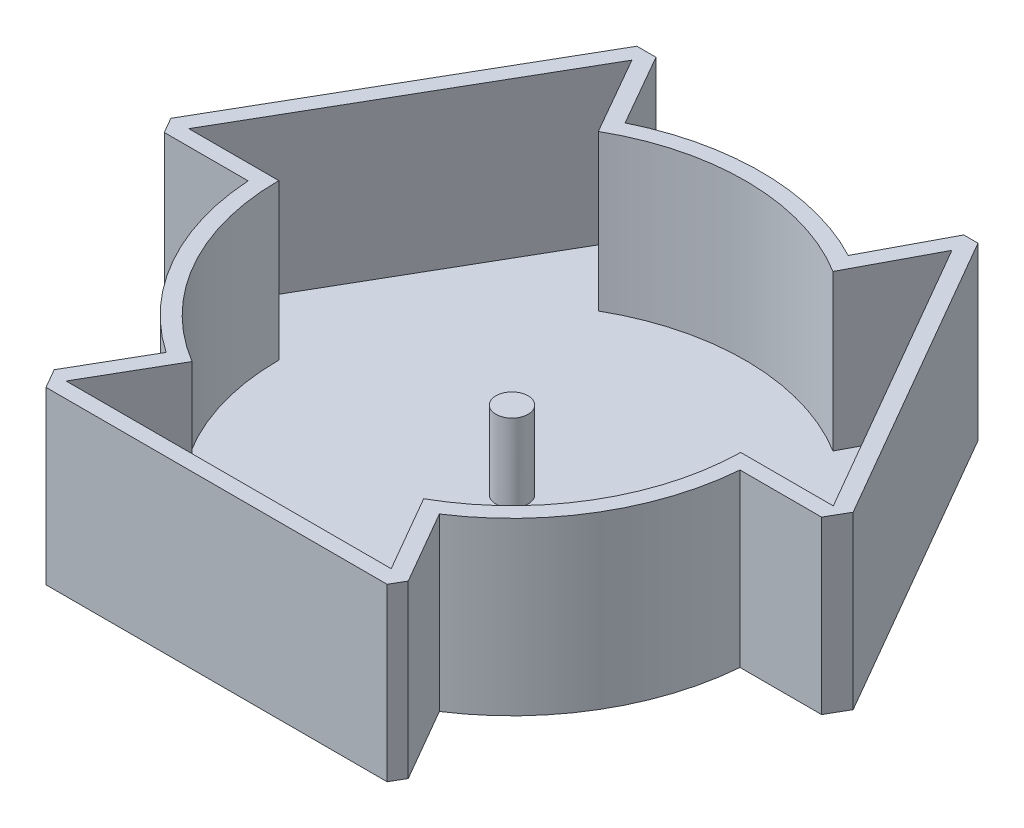
ISO-10303-21;
HEADER;
FILE_DESCRIPTION(('STEP AP214'),'2;1');
FILE_NAME('part.step','',(''),(''),'','','');
FILE_SCHEMA(('AUTOMOTIVE_DESIGN { 1 0 10303 214 1 1 1 1 }'));
ENDSEC;
DATA;
#1=APPLICATION_CONTEXT('core data for automotive mechanical design processes');
#2=APPLICATION_PROTOCOL_DEFINITION('international standard','automotive_design',2000,#1);
#3=PRODUCT_CONTEXT('',#1,'mechanical');
#4=PRODUCT('Part','Part','',(#3));
#5=PRODUCT_RELATED_PRODUCT_CATEGORY('part','',(#4));
#6=PRODUCT_DEFINITION_FORMATION('','',#4);
#7=PRODUCT_DEFINITION_CONTEXT('part definition',#1,'design');
#8=PRODUCT_DEFINITION('design','',#6,#7);
#9=PRODUCT_DEFINITION_SHAPE('','',#8);
#10=(LENGTH_UNIT() NAMED_UNIT(*) SI_UNIT(.MILLI.,.METRE.));
#11=(NAMED_UNIT(*) PLANE_ANGLE_UNIT() SI_UNIT($,.RADIAN.));
#12=(NAMED_UNIT(*) SI_UNIT($,.STERADIAN.) SOLID_ANGLE_UNIT());
#13=UNCERTAINTY_MEASURE_WITH_UNIT(LENGTH_MEASURE(1.E-05),#10,'distance_accuracy_value','');
#14=(GEOMETRIC_REPRESENTATION_CONTEXT(3) GLOBAL_UNCERTAINTY_ASSIGNED_CONTEXT((#13)) GLOBAL_UNIT_ASSIGNED_CONTEXT((#10,
#11,#12)) REPRESENTATION_CONTEXT('',''));
#15=CARTESIAN_POINT('',(0.,0.,0.));
#16=DIRECTION('',(0.,0.,1.));
#17=DIRECTION('',(1.,0.,0.));
#18=AXIS2_PLACEMENT_3D('',#15,#16,#17);
#19=CARTESIAN_POINT('',(1.89263037283323,25.4,-1.09271065523172));
#20=DIRECTION('',(0.866025403784439,0.,-0.499999999999999));
#21=DIRECTION('',(-0.499999999999999,0.,-0.866025403784439));
#22=AXIS2_PLACEMENT_3D('',#19,#20,#21);
#23=PLANE('',#22);
#24=DIRECTION('',(0.,-1.,0.));
#25=VECTOR('',#24,1.);
#26=CARTESIAN_POINT('',(29.1246775729801,25.4,46.0745786895366));
#27=LINE('',#26,#25);
#28=CARTESIAN_POINT('',(29.1246775729801,25.4,46.0745786895366));
#29=VERTEX_POINT('',#28);
#30=CARTESIAN_POINT('',(29.1246775729801,-2.54,46.0745786895366));
#31=VERTEX_POINT('',#30);
#32=EDGE_CURVE('E254',#29,#31,#27,.T.);
#33=ORIENTED_EDGE('',*,*,#32,.T.);
#34=DIRECTION('',(0.499999999999999,0.,0.866025403784439));
#35=VECTOR('',#34,1.);
#36=CARTESIAN_POINT('',(22.1832287726819,-2.54,34.051636689282));
#37=LINE('',#36,#35);
#38=CARTESIAN_POINT('',(22.1832287726819,-2.54,34.051636689282));
#39=VERTEX_POINT('',#38);
#40=EDGE_CURVE('E255',#39,#31,#37,.T.);
#41=ORIENTED_EDGE('',*,*,#40,.F.);
#42=DIRECTION('',(0.,-1.,0.));
#43=VECTOR('',#42,1.);
#44=CARTESIAN_POINT('',(22.1832287726819,25.4,34.051636689282));
#45=LINE('',#44,#43);
#46=CARTESIAN_POINT('',(22.1832287726819,25.4,34.051636689282));
#47=VERTEX_POINT('',#46);
#48=EDGE_CURVE('E60',#47,#39,#45,.T.);
#49=ORIENTED_EDGE('',*,*,#48,.F.);
#50=DIRECTION('',(0.499999999999999,0.,0.866025403784439));
#51=VECTOR('',#50,1.);
#52=CARTESIAN_POINT('',(1.89263037283323,25.4,-1.09271065523172));
#53=LINE('',#52,#51);
#54=EDGE_CURVE('E373',#47,#29,#53,.T.);
#55=ORIENTED_EDGE('',*,*,#54,.T.);
#56=EDGE_LOOP('',(#33,#41,#49,#55));
#57=FACE_BOUND('',#56,.T.);
#58=ADVANCED_FACE('F50',(#57),#23,.T.);
#59=CARTESIAN_POINT('',(0.,25.4,0.));
#60=DIRECTION('',(0.,-1.,0.));
#61=DIRECTION('',(0.,0.,-1.));
#62=AXIS2_PLACEMENT_3D('',#59,#60,#61);
#63=CYLINDRICAL_SURFACE('',#62,40.64);
#64=ORIENTED_EDGE('',*,*,#48,.T.);
#65=CARTESIAN_POINT('',(0.,-2.54,0.));
#66=DIRECTION('',(0.,-1.,0.));
#67=DIRECTION('',(0.,0.,-1.));
#68=AXIS2_PLACEMENT_3D('',#65,#66,#67);
#69=CIRCLE('',#68,40.64);
#70=CARTESIAN_POINT('',(40.5082745860141,-2.54,3.26944797543675));
#71=VERTEX_POINT('',#70);
#72=EDGE_CURVE('E244',#71,#39,#69,.T.);
#73=ORIENTED_EDGE('',*,*,#72,.F.);
#74=DIRECTION('',(0.,-1.,0.));
#75=VECTOR('',#74,1.);
#76=CARTESIAN_POINT('',(40.5082745860141,25.4,3.26944797543675));
#77=LINE('',#76,#75);
#78=CARTESIAN_POINT('',(40.5082745860141,25.4,3.26944797543675));
#79=VERTEX_POINT('',#78);
#80=EDGE_CURVE('E253',#79,#71,#77,.T.);
#81=ORIENTED_EDGE('',*,*,#80,.F.);
#82=CARTESIAN_POINT('',(0.,25.4,0.));
#83=DIRECTION('',(0.,1.,0.));
#84=DIRECTION('',(0.,0.,1.));
#85=AXIS2_PLACEMENT_3D('',#82,#83,#84);
#86=CIRCLE('',#85,40.64);
#87=EDGE_CURVE('E250',#47,#79,#86,.T.);
#88=ORIENTED_EDGE('',*,*,#87,.F.);
#89=EDGE_LOOP('',(#64,#73,#81,#88));
#90=FACE_BOUND('',#89,.T.);
#91=ADVANCED_FACE('F245',(#90),#63,.T.);
#92=CARTESIAN_POINT('',(0.,25.4,3.26944797543677));
#93=DIRECTION('',(0.,0.,-1.));
#94=DIRECTION('',(-1.,0.,0.));
#95=AXIS2_PLACEMENT_3D('',#92,#93,#94);
#96=PLANE('',#95);
#97=ORIENTED_EDGE('',*,*,#80,.T.);
#98=DIRECTION('',(-1.,0.,0.));
#99=VECTOR('',#98,1.);
#100=CARTESIAN_POINT('',(53.8382313134628,-2.54,3.26944797543675));
#101=LINE('',#100,#99);
#102=CARTESIAN_POINT('',(53.8382313134628,-2.54,3.26944797543675));
#103=VERTEX_POINT('',#102);
#104=EDGE_CURVE('E266',#103,#71,#101,.T.);
#105=ORIENTED_EDGE('',*,*,#104,.F.);
#106=DIRECTION('',(0.,-1.,0.));
#107=VECTOR('',#106,1.);
#108=CARTESIAN_POINT('',(53.8382313134628,25.4,3.26944797543675));
#109=LINE('',#108,#107);
#110=CARTESIAN_POINT('',(53.8382313134628,25.4,3.26944797543675));
#111=VERTEX_POINT('',#110);
#112=EDGE_CURVE('E517',#111,#103,#109,.T.);
#113=ORIENTED_EDGE('',*,*,#112,.F.);
#114=DIRECTION('',(1.,0.,0.));
#115=VECTOR('',#114,1.);
#116=CARTESIAN_POINT('',(0.,25.4,3.26944797543677));
#117=LINE('',#116,#115);
#118=EDGE_CURVE('E378',#79,#111,#117,.T.);
#119=ORIENTED_EDGE('',*,*,#118,.F.);
#120=EDGE_LOOP('',(#97,#105,#113,#119));
#121=FACE_BOUND('',#120,.T.);
#122=ADVANCED_FACE('F626',(#121),#96,.F.);
#123=CARTESIAN_POINT('',(41.7943859866369,25.4,24.1300000000001));
#124=DIRECTION('',(-0.866025403784438,0.,-0.500000000000002));
#125=DIRECTION('',(-0.500000000000002,0.,0.866025403784438));
#126=AXIS2_PLACEMENT_3D('',#123,#124,#125);
#127=PLANE('',#126);
#128=ORIENTED_EDGE('',*,*,#112,.T.);
#129=DIRECTION('',(-0.500000000000001,0.,0.866025403784438));
#130=VECTOR('',#129,1.);
#131=CARTESIAN_POINT('',(55.7258479821827,-2.54,0.));
#132=LINE('',#131,#130);
#133=CARTESIAN_POINT('',(55.7258479821827,-2.54,0.));
#134=VERTEX_POINT('',#133);
#135=EDGE_CURVE('E327',#134,#103,#132,.T.);
#136=ORIENTED_EDGE('',*,*,#135,.F.);
#137=DIRECTION('',(0.,-1.,0.));
#138=VECTOR('',#137,1.);
#139=CARTESIAN_POINT('',(55.7258479821827,25.4,0.));
#140=LINE('',#139,#138);
#141=CARTESIAN_POINT('',(55.7258479821827,25.4,0.));
#142=VERTEX_POINT('',#141);
#143=EDGE_CURVE('E518',#142,#134,#140,.T.);
#144=ORIENTED_EDGE('',*,*,#143,.F.);
#145=DIRECTION('',(0.500000000000002,0.,-0.866025403784438));
#146=VECTOR('',#145,1.);
#147=CARTESIAN_POINT('',(41.7943859866369,25.4,24.1300000000001));
#148=LINE('',#147,#146);
#149=EDGE_CURVE('E385',#111,#142,#148,.T.);
#150=ORIENTED_EDGE('',*,*,#149,.F.);
#151=EDGE_LOOP('',(#128,#136,#144,#150));
#152=FACE_BOUND('',#151,.T.);
#153=ADVANCED_FACE('F904',(#152),#127,.F.);
#154=CARTESIAN_POINT('',(41.794385986637,25.4,-24.13));
#155=DIRECTION('',(-0.866025403784439,0.,0.5));
#156=DIRECTION('',(0.5,0.,0.866025403784439));
#157=AXIS2_PLACEMENT_3D('',#154,#155,#156);
#158=PLANE('',#157);
#159=ORIENTED_EDGE('',*,*,#143,.T.);
#160=DIRECTION('',(0.5,0.,0.866025403784439));
#161=VECTOR('',#160,1.);
#162=CARTESIAN_POINT('',(27.8629239910913,-2.54,-48.26));
#163=LINE('',#162,#161);
#164=CARTESIAN_POINT('',(27.8629239910913,-2.54,-48.26));
#165=VERTEX_POINT('',#164);
#166=EDGE_CURVE('E322',#165,#134,#163,.T.);
#167=ORIENTED_EDGE('',*,*,#166,.F.);
#168=DIRECTION('',(0.,-1.,0.));
#169=VECTOR('',#168,1.);
#170=CARTESIAN_POINT('',(27.8629239910913,25.4,-48.26));
#171=LINE('',#170,#169);
#172=CARTESIAN_POINT('',(27.8629239910913,25.4,-48.26));
#173=VERTEX_POINT('',#172);
#174=EDGE_CURVE('E511',#173,#165,#171,.T.);
#175=ORIENTED_EDGE('',*,*,#174,.F.);
#176=DIRECTION('',(-0.5,0.,-0.866025403784439));
#177=VECTOR('',#176,1.);
#178=CARTESIAN_POINT('',(41.794385986637,25.4,-24.13));
#179=LINE('',#178,#177);
#180=EDGE_CURVE('E387',#142,#173,#179,.T.);
#181=ORIENTED_EDGE('',*,*,#180,.F.);
#182=EDGE_LOOP('',(#159,#167,#175,#181));
#183=FACE_BOUND('',#182,.T.);
#184=ADVANCED_FACE('F894',(#183),#158,.F.);
#185=CARTESIAN_POINT('',(0.,25.4,-48.26));
#186=DIRECTION('',(0.,0.,1.));
#187=DIRECTION('',(1.,0.,0.));
#188=AXIS2_PLACEMENT_3D('',#185,#186,#187);
#189=PLANE('',#188);
#190=ORIENTED_EDGE('',*,*,#174,.T.);
#191=DIRECTION('',(1.,0.,0.));
#192=VECTOR('',#191,1.);
#193=CARTESIAN_POINT('',(25.5330111041425,-2.54,-48.26));
#194=LINE('',#193,#192);
#195=CARTESIAN_POINT('',(25.5330111041425,-2.54,-48.26));
#196=VERTEX_POINT('',#195);
#197=EDGE_CURVE('E319',#196,#165,#194,.T.);
#198=ORIENTED_EDGE('',*,*,#197,.F.);
#199=DIRECTION('',(0.,-1.,0.));
#200=VECTOR('',#199,1.);
#201=CARTESIAN_POINT('',(25.5330111041425,25.4,-48.26));
#202=LINE('',#201,#200);
#203=CARTESIAN_POINT('',(25.5330111041425,25.4,-48.26));
#204=VERTEX_POINT('',#203);
#205=EDGE_CURVE('E509',#204,#196,#202,.T.);
#206=ORIENTED_EDGE('',*,*,#205,.F.);
#207=DIRECTION('',(-1.,0.,0.));
#208=VECTOR('',#207,1.);
#209=CARTESIAN_POINT('',(0.,25.4,-48.26));
#210=LINE('',#209,#208);
#211=EDGE_CURVE('E388',#173,#204,#210,.T.);
#212=ORIENTED_EDGE('',*,*,#211,.F.);
#213=EDGE_LOOP('',(#190,#198,#206,#212));
#214=FACE_BOUND('',#213,.T.);
#215=ADVANCED_FACE('F883',(#214),#189,.F.);
#216=CARTESIAN_POINT('',(0.,25.4,0.));
#217=DIRECTION('',(0.883912099849341,0.,0.467653076264798));
#218=DIRECTION('',(0.467653076264798,0.,-0.883912099849341));
#219=AXIS2_PLACEMENT_3D('',#216,#217,#218);
#220=PLANE('',#219);
#221=ORIENTED_EDGE('',*,*,#205,.T.);
#222=DIRECTION('',(0.467653076264798,0.,-0.883912099849341));
#223=VECTOR('',#222,1.);
#224=CARTESIAN_POINT('',(19.0054210194014,-2.54,-35.9221877378772));
#225=LINE('',#224,#223);
#226=CARTESIAN_POINT('',(19.0054210194014,-2.54,-35.9221877378772));
#227=VERTEX_POINT('',#226);
#228=EDGE_CURVE('E316',#227,#196,#225,.T.);
#229=ORIENTED_EDGE('',*,*,#228,.F.);
#230=DIRECTION('',(0.,-1.,0.));
#231=VECTOR('',#230,1.);
#232=CARTESIAN_POINT('',(19.0054210194014,25.4,-35.9221877378772));
#233=LINE('',#232,#231);
#234=CARTESIAN_POINT('',(19.0054210194014,25.4,-35.9221877378772));
#235=VERTEX_POINT('',#234);
#236=EDGE_CURVE('E510',#235,#227,#233,.T.);
#237=ORIENTED_EDGE('',*,*,#236,.F.);
#238=DIRECTION('',(-0.467653076264798,0.,0.883912099849341));
#239=VECTOR('',#238,1.);
#240=CARTESIAN_POINT('',(0.,25.4,0.));
#241=LINE('',#240,#239);
#242=EDGE_CURVE('E392',#204,#235,#241,.T.);
#243=ORIENTED_EDGE('',*,*,#242,.F.);
#244=EDGE_LOOP('',(#221,#229,#237,#243));
#245=FACE_BOUND('',#244,.T.);
#246=ADVANCED_FACE('F874',(#245),#220,.F.);
#247=CARTESIAN_POINT('',(0.,25.4,0.));
#248=DIRECTION('',(0.,-1.,0.));
#249=DIRECTION('',(0.,0.,-1.));
#250=AXIS2_PLACEMENT_3D('',#247,#248,#249);
#251=CYLINDRICAL_SURFACE('',#250,40.64);
#252=ORIENTED_EDGE('',*,*,#236,.T.);
#253=CARTESIAN_POINT('',(0.,-2.54,0.));
#254=DIRECTION('',(0.,-1.,0.));
#255=DIRECTION('',(0.,0.,-1.));
#256=AXIS2_PLACEMENT_3D('',#253,#254,#255);
#257=CIRCLE('',#256,40.64);
#258=CARTESIAN_POINT('',(-17.9750099502659,-2.54,-36.4487121485498));
#259=VERTEX_POINT('',#258);
#260=EDGE_CURVE('E315',#259,#227,#257,.T.);
#261=ORIENTED_EDGE('',*,*,#260,.F.);
#262=DIRECTION('',(0.,-1.,0.));
#263=VECTOR('',#262,1.);
#264=CARTESIAN_POINT('',(-17.9750099502659,25.4,-36.4487121485498));
#265=LINE('',#264,#263);
#266=CARTESIAN_POINT('',(-17.9750099502659,25.4,-36.4487121485498));
#267=VERTEX_POINT('',#266);
#268=EDGE_CURVE('E502',#267,#259,#265,.T.);
#269=ORIENTED_EDGE('',*,*,#268,.F.);
#270=CARTESIAN_POINT('',(0.,25.4,0.));
#271=DIRECTION('',(0.,1.,0.));
#272=DIRECTION('',(0.,0.,1.));
#273=AXIS2_PLACEMENT_3D('',#270,#271,#272);
#274=CIRCLE('',#273,40.64);
#275=EDGE_CURVE('E398',#235,#267,#274,.T.);
#276=ORIENTED_EDGE('',*,*,#275,.F.);
#277=EDGE_LOOP('',(#252,#261,#269,#276));
#278=FACE_BOUND('',#277,.T.);
#279=ADVANCED_FACE('F862',(#278),#251,.T.);
#280=CARTESIAN_POINT('',(2.17388127227108,25.4,-1.24419538492157));
#281=DIRECTION('',(0.867902843515905,0.,-0.496733987378564));
#282=DIRECTION('',(-0.496733987378564,0.,-0.867902843515905));
#283=AXIS2_PLACEMENT_3D('',#280,#281,#282);
#284=PLANE('',#283);
#285=ORIENTED_EDGE('',*,*,#268,.T.);
#286=DIRECTION('',(0.496733987378564,0.,0.867902843515905));
#287=VECTOR('',#286,1.);
#288=CARTESIAN_POINT('',(-24.7350616707548,-2.54,-48.26));
#289=LINE('',#288,#287);
#290=CARTESIAN_POINT('',(-24.7350616707548,-2.54,-48.26));
#291=VERTEX_POINT('',#290);
#292=EDGE_CURVE('E306',#291,#259,#289,.T.);
#293=ORIENTED_EDGE('',*,*,#292,.F.);
#294=DIRECTION('',(0.,-1.,0.));
#295=VECTOR('',#294,1.);
#296=CARTESIAN_POINT('',(-24.7350616707548,25.4,-48.26));
#297=LINE('',#296,#295);
#298=CARTESIAN_POINT('',(-24.7350616707548,25.4,-48.26));
#299=VERTEX_POINT('',#298);
#300=EDGE_CURVE('E503',#299,#291,#297,.T.);
#301=ORIENTED_EDGE('',*,*,#300,.F.);
#302=DIRECTION('',(0.496733987378564,0.,0.867902843515905));
#303=VECTOR('',#302,1.);
#304=CARTESIAN_POINT('',(2.17388127227108,25.4,-1.24419538492157));
#305=LINE('',#304,#303);
#306=EDGE_CURVE('E402',#299,#267,#305,.T.);
#307=ORIENTED_EDGE('',*,*,#306,.T.);
#308=EDGE_LOOP('',(#285,#293,#301,#307));
#309=FACE_BOUND('',#308,.T.);
#310=ADVANCED_FACE('F854',(#309),#284,.T.);
#311=CARTESIAN_POINT('',(0.,25.4,-48.26));
#312=DIRECTION('',(0.,0.,1.));
#313=DIRECTION('',(1.,0.,0.));
#314=AXIS2_PLACEMENT_3D('',#311,#312,#313);
#315=PLANE('',#314);
#316=ORIENTED_EDGE('',*,*,#300,.T.);
#317=DIRECTION('',(1.,0.,0.));
#318=VECTOR('',#317,1.);
#319=CARTESIAN_POINT('',(-27.8629239910913,-2.54,-48.26));
#320=LINE('',#319,#318);
#321=CARTESIAN_POINT('',(-27.8629239910913,-2.54,-48.26));
#322=VERTEX_POINT('',#321);
#323=EDGE_CURVE('E302',#322,#291,#320,.T.);
#324=ORIENTED_EDGE('',*,*,#323,.F.);
#325=DIRECTION('',(0.,-1.,0.));
#326=VECTOR('',#325,1.);
#327=CARTESIAN_POINT('',(-27.8629239910913,25.4,-48.26));
#328=LINE('',#327,#326);
#329=CARTESIAN_POINT('',(-27.8629239910913,25.4,-48.26));
#330=VERTEX_POINT('',#329);
#331=EDGE_CURVE('E499',#330,#322,#328,.T.);
#332=ORIENTED_EDGE('',*,*,#331,.F.);
#333=DIRECTION('',(-1.,0.,0.));
#334=VECTOR('',#333,1.);
#335=CARTESIAN_POINT('',(0.,25.4,-48.26));
#336=LINE('',#335,#334);
#337=EDGE_CURVE('E403',#299,#330,#336,.T.);
#338=ORIENTED_EDGE('',*,*,#337,.F.);
#339=EDGE_LOOP('',(#316,#324,#332,#338));
#340=FACE_BOUND('',#339,.T.);
#341=ADVANCED_FACE('F843',(#340),#315,.F.);
#342=CARTESIAN_POINT('',(-41.794385986637,25.4,-24.13));
#343=DIRECTION('',(0.866025403784439,0.,0.5));
#344=DIRECTION('',(0.5,0.,-0.866025403784439));
#345=AXIS2_PLACEMENT_3D('',#342,#343,#344);
#346=PLANE('',#345);
#347=ORIENTED_EDGE('',*,*,#331,.T.);
#348=DIRECTION('',(0.5,0.,-0.866025403784438));
#349=VECTOR('',#348,1.);
#350=CARTESIAN_POINT('',(-55.7258479821827,-2.54,0.));
#351=LINE('',#350,#349);
#352=CARTESIAN_POINT('',(-55.7258479821827,-2.54,0.));
#353=VERTEX_POINT('',#352);
#354=EDGE_CURVE('E299',#353,#322,#351,.T.);
#355=ORIENTED_EDGE('',*,*,#354,.F.);
#356=DIRECTION('',(0.,-1.,0.));
#357=VECTOR('',#356,1.);
#358=CARTESIAN_POINT('',(-55.7258479821827,25.4,0.));
#359=LINE('',#358,#357);
#360=CARTESIAN_POINT('',(-55.7258479821827,25.4,0.));
#361=VERTEX_POINT('',#360);
#362=EDGE_CURVE('E494',#361,#353,#359,.T.);
#363=ORIENTED_EDGE('',*,*,#362,.F.);
#364=DIRECTION('',(-0.5,0.,0.866025403784439));
#365=VECTOR('',#364,1.);
#366=CARTESIAN_POINT('',(-41.794385986637,25.4,-24.13));
#367=LINE('',#366,#365);
#368=EDGE_CURVE('E407',#330,#361,#367,.T.);
#369=ORIENTED_EDGE('',*,*,#368,.F.);
#370=EDGE_LOOP('',(#347,#355,#363,#369));
#371=FACE_BOUND('',#370,.T.);
#372=ADVANCED_FACE('F834',(#371),#346,.F.);
#373=CARTESIAN_POINT('',(-41.7943859866369,25.4,24.13));
#374=DIRECTION('',(0.866025403784438,0.,-0.500000000000001));
#375=DIRECTION('',(-0.500000000000001,0.,-0.866025403784438));
#376=AXIS2_PLACEMENT_3D('',#373,#374,#375);
#377=PLANE('',#376);
#378=ORIENTED_EDGE('',*,*,#362,.T.);
#379=DIRECTION('',(-0.500000000000002,0.,-0.866025403784438));
#380=VECTOR('',#379,1.);
#381=CARTESIAN_POINT('',(-54.259378298441,-2.54,2.54000000000001));
#382=LINE('',#381,#380);
#383=CARTESIAN_POINT('',(-54.259378298441,-2.54,2.54000000000001));
#384=VERTEX_POINT('',#383);
#385=EDGE_CURVE('E298',#384,#353,#382,.T.);
#386=ORIENTED_EDGE('',*,*,#385,.F.);
#387=DIRECTION('',(0.,-1.,0.));
#388=VECTOR('',#387,1.);
#389=CARTESIAN_POINT('',(-54.259378298441,25.4,2.54000000000001));
#390=LINE('',#389,#388);
#391=CARTESIAN_POINT('',(-54.259378298441,25.4,2.54000000000001));
#392=VERTEX_POINT('',#391);
#393=EDGE_CURVE('E495',#392,#384,#390,.T.);
#394=ORIENTED_EDGE('',*,*,#393,.F.);
#395=DIRECTION('',(0.500000000000001,0.,0.866025403784438));
#396=VECTOR('',#395,1.);
#397=CARTESIAN_POINT('',(-41.7943859866369,25.4,24.13));
#398=LINE('',#397,#396);
#399=EDGE_CURVE('E413',#361,#392,#398,.T.);
#400=ORIENTED_EDGE('',*,*,#399,.F.);
#401=EDGE_LOOP('',(#378,#386,#394,#400));
#402=FACE_BOUND('',#401,.T.);
#403=ADVANCED_FACE('F824',(#402),#377,.F.);
#404=CARTESIAN_POINT('',(0.,25.4,2.54000000000001));
#405=DIRECTION('',(0.,0.,-1.));
#406=DIRECTION('',(-1.,0.,0.));
#407=AXIS2_PLACEMENT_3D('',#404,#405,#406);
#408=PLANE('',#407);
#409=ORIENTED_EDGE('',*,*,#393,.T.);
#410=DIRECTION('',(-1.,0.,0.));
#411=VECTOR('',#410,1.);
#412=CARTESIAN_POINT('',(-40.5605473335851,-2.54,2.54000000000001));
#413=LINE('',#412,#411);
#414=CARTESIAN_POINT('',(-40.5605473335851,-2.54,2.54000000000003));
#415=VERTEX_POINT('',#414);
#416=EDGE_CURVE('E295',#415,#384,#413,.T.);
#417=ORIENTED_EDGE('',*,*,#416,.F.);
#418=DIRECTION('',(0.,-1.,0.));
#419=VECTOR('',#418,1.);
#420=CARTESIAN_POINT('',(-40.5605473335851,25.4,2.54000000000001));
#421=LINE('',#420,#419);
#422=CARTESIAN_POINT('',(-40.5605473335851,25.4,2.54000000000001));
#423=VERTEX_POINT('',#422);
#424=EDGE_CURVE('E487',#423,#415,#421,.T.);
#425=ORIENTED_EDGE('',*,*,#424,.F.);
#426=DIRECTION('',(1.,0.,0.));
#427=VECTOR('',#426,1.);
#428=CARTESIAN_POINT('',(0.,25.4,2.54000000000001));
#429=LINE('',#428,#427);
#430=EDGE_CURVE('E417',#392,#423,#429,.T.);
#431=ORIENTED_EDGE('',*,*,#430,.F.);
#432=EDGE_LOOP('',(#409,#417,#425,#431));
#433=FACE_BOUND('',#432,.T.);
#434=ADVANCED_FACE('F814',(#433),#408,.F.);
#435=CARTESIAN_POINT('',(0.,25.4,0.));
#436=DIRECTION('',(0.,-1.,0.));
#437=DIRECTION('',(0.,0.,-1.));
#438=AXIS2_PLACEMENT_3D('',#435,#436,#437);
#439=CYLINDRICAL_SURFACE('',#438,40.64);
#440=ORIENTED_EDGE('',*,*,#424,.T.);
#441=CARTESIAN_POINT('',(0.,-2.54,0.));
#442=DIRECTION('',(0.,-1.,0.));
#443=DIRECTION('',(0.,0.,-1.));
#444=AXIS2_PLACEMENT_3D('',#441,#442,#443);
#445=CIRCLE('',#444,40.64);
#446=CARTESIAN_POINT('',(-22.997765154499,-2.54,33.5069007504202));
#447=VERTEX_POINT('',#446);
#448=EDGE_CURVE('E288',#447,#415,#445,.T.);
#449=ORIENTED_EDGE('',*,*,#448,.F.);
#450=DIRECTION('',(0.,-1.,0.));
#451=VECTOR('',#450,1.);
#452=CARTESIAN_POINT('',(-22.997765154499,25.4,33.5069007504202));
#453=LINE('',#452,#451);
#454=CARTESIAN_POINT('',(-22.997765154499,25.4,33.5069007504202));
#455=VERTEX_POINT('',#454);
#456=EDGE_CURVE('E486',#455,#447,#453,.T.);
#457=ORIENTED_EDGE('',*,*,#456,.F.);
#458=CARTESIAN_POINT('',(0.,25.4,0.));
#459=DIRECTION('',(0.,1.,0.));
#460=DIRECTION('',(0.,0.,1.));
#461=AXIS2_PLACEMENT_3D('',#458,#459,#460);
#462=CIRCLE('',#461,40.64);
#463=EDGE_CURVE('E423',#423,#455,#462,.T.);
#464=ORIENTED_EDGE('',*,*,#463,.F.);
#465=EDGE_LOOP('',(#440,#449,#457,#464));
#466=FACE_BOUND('',#465,.T.);
#467=ADVANCED_FACE('F804',(#466),#439,.T.);
#468=CARTESIAN_POINT('',(-2.73941023990045,25.4,-1.58159923942733));
#469=DIRECTION('',(0.86602540378444,0.,0.499999999999998));
#470=DIRECTION('',(0.499999999999998,0.,-0.86602540378444));
#471=AXIS2_PLACEMENT_3D('',#468,#469,#470);
#472=PLANE('',#471);
#473=ORIENTED_EDGE('',*,*,#456,.T.);
#474=DIRECTION('',(0.499999999999997,0.,-0.86602540378444));
#475=VECTOR('',#474,1.);
#476=CARTESIAN_POINT('',(-29.6891974843582,-2.54,45.0968015211454));
#477=LINE('',#476,#475);
#478=CARTESIAN_POINT('',(-29.6891974843582,-2.54,45.0968015211454));
#479=VERTEX_POINT('',#478);
#480=EDGE_CURVE('E282',#479,#447,#477,.T.);
#481=ORIENTED_EDGE('',*,*,#480,.F.);
#482=DIRECTION('',(0.,-1.,0.));
#483=VECTOR('',#482,1.);
#484=CARTESIAN_POINT('',(-29.6891974843582,25.4,45.0968015211454));
#485=LINE('',#484,#483);
#486=CARTESIAN_POINT('',(-29.6891974843582,25.4,45.0968015211454));
#487=VERTEX_POINT('',#486);
#488=EDGE_CURVE('E483',#487,#479,#485,.T.);
#489=ORIENTED_EDGE('',*,*,#488,.F.);
#490=DIRECTION('',(-0.499999999999998,0.,0.86602540378444));
#491=VECTOR('',#490,1.);
#492=CARTESIAN_POINT('',(-2.73941023990045,25.4,-1.58159923942733));
#493=LINE('',#492,#491);
#494=EDGE_CURVE('E422',#455,#487,#493,.T.);
#495=ORIENTED_EDGE('',*,*,#494,.F.);
#496=EDGE_LOOP('',(#473,#481,#489,#495));
#497=FACE_BOUND('',#496,.T.);
#498=ADVANCED_FACE('F794',(#497),#472,.F.);
#499=CARTESIAN_POINT('',(-41.7943859866369,25.4,24.1300000000001));
#500=DIRECTION('',(0.866025403784437,0.,-0.500000000000002));
#501=DIRECTION('',(-0.500000000000002,0.,-0.866025403784437));
#502=AXIS2_PLACEMENT_3D('',#499,#500,#501);
#503=PLANE('',#502);
#504=ORIENTED_EDGE('',*,*,#488,.T.);
#505=DIRECTION('',(-0.500000000000005,0.,-0.866025403784436));
#506=VECTOR('',#505,1.);
#507=CARTESIAN_POINT('',(-27.8629239910912,-2.54,48.26));
#508=LINE('',#507,#506);
#509=CARTESIAN_POINT('',(-27.8629239910912,-2.54,48.26));
#510=VERTEX_POINT('',#509);
#511=EDGE_CURVE('E278',#510,#479,#508,.T.);
#512=ORIENTED_EDGE('',*,*,#511,.F.);
#513=DIRECTION('',(0.,-1.,0.));
#514=VECTOR('',#513,1.);
#515=CARTESIAN_POINT('',(-27.8629239910912,25.4,48.26));
#516=LINE('',#515,#514);
#517=CARTESIAN_POINT('',(-27.8629239910912,25.4,48.26));
#518=VERTEX_POINT('',#517);
#519=EDGE_CURVE('E477',#518,#510,#516,.T.);
#520=ORIENTED_EDGE('',*,*,#519,.F.);
#521=DIRECTION('',(0.500000000000002,0.,0.866025403784437));
#522=VECTOR('',#521,1.);
#523=CARTESIAN_POINT('',(-41.7943859866369,25.4,24.1300000000001));
#524=LINE('',#523,#522);
#525=EDGE_CURVE('E427',#487,#518,#524,.T.);
#526=ORIENTED_EDGE('',*,*,#525,.F.);
#527=EDGE_LOOP('',(#504,#512,#520,#526));
#528=FACE_BOUND('',#527,.T.);
#529=ADVANCED_FACE('F787',(#528),#503,.F.);
#530=CARTESIAN_POINT('',(0.,25.4,48.26));
#531=DIRECTION('',(0.,0.,-1.));
#532=DIRECTION('',(-1.,0.,0.));
#533=AXIS2_PLACEMENT_3D('',#530,#531,#532);
#534=PLANE('',#533);
#535=ORIENTED_EDGE('',*,*,#519,.T.);
#536=DIRECTION('',(-1.,0.,0.));
#537=VECTOR('',#536,1.);
#538=CARTESIAN_POINT('',(27.8629239910914,-2.54,48.26));
#539=LINE('',#538,#537);
#540=CARTESIAN_POINT('',(27.8629239910914,-2.54,48.26));
#541=VERTEX_POINT('',#540);
#542=EDGE_CURVE('E277',#541,#510,#539,.T.);
#543=ORIENTED_EDGE('',*,*,#542,.F.);
#544=DIRECTION('',(0.,-1.,0.));
#545=VECTOR('',#544,1.);
#546=CARTESIAN_POINT('',(27.8629239910914,25.4,48.26));
#547=LINE('',#546,#545);
#548=CARTESIAN_POINT('',(27.8629239910914,25.4,48.26));
#549=VERTEX_POINT('',#548);
#550=EDGE_CURVE('E478',#549,#541,#547,.T.);
#551=ORIENTED_EDGE('',*,*,#550,.F.);
#552=DIRECTION('',(1.,0.,0.));
#553=VECTOR('',#552,1.);
#554=CARTESIAN_POINT('',(0.,25.4,48.26));
#555=LINE('',#554,#553);
#556=EDGE_CURVE('E433',#518,#549,#555,.T.);
#557=ORIENTED_EDGE('',*,*,#556,.F.);
#558=EDGE_LOOP('',(#535,#543,#551,#557));
#559=FACE_BOUND('',#558,.T.);
#560=ADVANCED_FACE('F777',(#559),#534,.F.);
#561=CARTESIAN_POINT('',(0.,25.4,0.));
#562=DIRECTION('',(0.,-1.,0.));
#563=DIRECTION('',(0.,0.,-1.));
#564=AXIS2_PLACEMENT_3D('',#561,#562,#563);
#565=CYLINDRICAL_SURFACE('',#564,38.1);
#566=CARTESIAN_POINT('',(0.,0.,0.));
#567=DIRECTION('',(0.,1.,0.));
#568=DIRECTION('',(0.,0.,1.));
#569=AXIS2_PLACEMENT_3D('',#566,#567,#568);
#570=CIRCLE('',#569,38.1);
#571=CARTESIAN_POINT('',(18.7421008552947,0.,33.1714283010238));
#572=VERTEX_POINT('',#571);
#573=CARTESIAN_POINT('',(38.0930164945116,0.,0.729447975436735));
#574=VERTEX_POINT('',#573);
#575=EDGE_CURVE('E334',#572,#574,#570,.T.);
#576=ORIENTED_EDGE('',*,*,#575,.F.);
#577=DIRECTION('',(0.,-1.,0.));
#578=VECTOR('',#577,1.);
#579=CARTESIAN_POINT('',(18.7421008552947,25.4,33.1714283010238));
#580=LINE('',#579,#578);
#581=CARTESIAN_POINT('',(18.7421008552947,25.4,33.1714283010238));
#582=VERTEX_POINT('',#581);
#583=EDGE_CURVE('E480',#582,#572,#580,.T.);
#584=ORIENTED_EDGE('',*,*,#583,.F.);
#585=CARTESIAN_POINT('',(0.,25.4,0.));
#586=DIRECTION('',(0.,1.,0.));
#587=DIRECTION('',(0.,0.,1.));
#588=AXIS2_PLACEMENT_3D('',#585,#586,#587);
#589=CIRCLE('',#588,38.1);
#590=CARTESIAN_POINT('',(38.0930164945116,25.4,0.729447975436735));
#591=VERTEX_POINT('',#590);
#592=EDGE_CURVE('E331',#582,#591,#589,.T.);
#593=ORIENTED_EDGE('',*,*,#592,.T.);
#594=DIRECTION('',(0.,-1.,0.));
#595=VECTOR('',#594,1.);
#596=CARTESIAN_POINT('',(38.0930164945116,25.4,0.729447975436735));
#597=LINE('',#596,#595);
#598=EDGE_CURVE('E437',#591,#574,#597,.T.);
#599=ORIENTED_EDGE('',*,*,#598,.T.);
#600=EDGE_LOOP('',(#576,#584,#593,#599));
#601=FACE_BOUND('',#600,.T.);
#602=ADVANCED_FACE('F572',(#601),#565,.F.);
#603=CARTESIAN_POINT('',(-0.307074152779242,25.4,0.177289344768272));
#604=DIRECTION('',(0.866025403784439,0.,-0.499999999999999));
#605=DIRECTION('',(-0.499999999999999,0.,-0.866025403784439));
#606=AXIS2_PLACEMENT_3D('',#603,#604,#605);
#607=PLANE('',#606);
#608=DIRECTION('',(0.499999999999999,0.,0.866025403784439));
#609=VECTOR('',#608,1.);
#610=CARTESIAN_POINT('',(-0.307074152779242,0.,0.177289344768272));
#611=LINE('',#610,#609);
#612=CARTESIAN_POINT('',(25.987022103644,0.,45.72));
#613=VERTEX_POINT('',#612);
#614=EDGE_CURVE('E442',#572,#613,#611,.T.);
#615=ORIENTED_EDGE('',*,*,#614,.T.);
#616=DIRECTION('',(0.,-1.,0.));
#617=VECTOR('',#616,1.);
#618=CARTESIAN_POINT('',(25.987022103644,25.4,45.72));
#619=LINE('',#618,#617);
#620=CARTESIAN_POINT('',(25.987022103644,25.4,45.72));
#621=VERTEX_POINT('',#620);
#622=EDGE_CURVE('E563',#621,#613,#619,.T.);
#623=ORIENTED_EDGE('',*,*,#622,.F.);
#624=DIRECTION('',(0.499999999999999,0.,0.866025403784439));
#625=VECTOR('',#624,1.);
#626=CARTESIAN_POINT('',(-0.307074152779242,25.4,0.177289344768272));
#627=LINE('',#626,#625);
#628=EDGE_CURVE('E336',#582,#621,#627,.T.);
#629=ORIENTED_EDGE('',*,*,#628,.F.);
#630=ORIENTED_EDGE('',*,*,#583,.T.);
#631=EDGE_LOOP('',(#615,#623,#629,#630));
#632=FACE_BOUND('',#631,.T.);
#633=ADVANCED_FACE('F47',(#632),#607,.F.);
#634=CARTESIAN_POINT('',(0.,25.4,45.72));
#635=DIRECTION('',(0.,0.,-1.));
#636=DIRECTION('',(-1.,0.,0.));
#637=AXIS2_PLACEMENT_3D('',#634,#635,#636);
#638=PLANE('',#637);
#639=DIRECTION('',(1.,0.,0.));
#640=VECTOR('',#639,1.);
#641=CARTESIAN_POINT('',(0.,0.,45.72));
#642=LINE('',#641,#640);
#643=CARTESIAN_POINT('',(-27.1160619264001,0.,45.72));
#644=VERTEX_POINT('',#643);
#645=EDGE_CURVE('E450',#644,#613,#642,.T.);
#646=ORIENTED_EDGE('',*,*,#645,.F.);
#647=DIRECTION('',(0.,-1.,0.));
#648=VECTOR('',#647,1.);
#649=CARTESIAN_POINT('',(-27.1160619264001,25.4,45.72));
#650=LINE('',#649,#648);
#651=CARTESIAN_POINT('',(-27.1160619264001,25.4,45.72));
#652=VERTEX_POINT('',#651);
#653=EDGE_CURVE('E557',#652,#644,#650,.T.);
#654=ORIENTED_EDGE('',*,*,#653,.F.);
#655=DIRECTION('',(1.,0.,0.));
#656=VECTOR('',#655,1.);
#657=CARTESIAN_POINT('',(0.,25.4,45.72));
#658=LINE('',#657,#656);
#659=EDGE_CURVE('E342',#652,#621,#658,.T.);
#660=ORIENTED_EDGE('',*,*,#659,.T.);
#661=ORIENTED_EDGE('',*,*,#622,.T.);
#662=EDGE_LOOP('',(#646,#654,#660,#661));
#663=FACE_BOUND('',#662,.T.);
#664=ADVANCED_FACE('F579',(#663),#638,.T.);
#665=CARTESIAN_POINT('',(-0.539705714288003,25.4,-0.311599239427356));
#666=DIRECTION('',(-0.86602540378444,0.,-0.499999999999997));
#667=DIRECTION('',(-0.499999999999997,0.,0.86602540378444));
#668=AXIS2_PLACEMENT_3D('',#665,#666,#667);
#669=PLANE('',#668);
#670=DIRECTION('',(0.499999999999997,0.,-0.86602540378444));
#671=VECTOR('',#670,1.);
#672=CARTESIAN_POINT('',(-0.539705714288003,0.,-0.311599239427356));
#673=LINE('',#672,#671);
#674=CARTESIAN_POINT('',(-19.5871571426021,0.,32.6795543891133));
#675=VERTEX_POINT('',#674);
#676=EDGE_CURVE('E451',#644,#675,#673,.T.);
#677=ORIENTED_EDGE('',*,*,#676,.T.);
#678=DIRECTION('',(0.,-1.,0.));
#679=VECTOR('',#678,1.);
#680=CARTESIAN_POINT('',(-19.5871571426021,25.4,32.6795543891133));
#681=LINE('',#680,#679);
#682=CARTESIAN_POINT('',(-19.5871571426021,25.4,32.6795543891133));
#683=VERTEX_POINT('',#682);
#684=EDGE_CURVE('E553',#683,#675,#681,.T.);
#685=ORIENTED_EDGE('',*,*,#684,.F.);
#686=DIRECTION('',(0.499999999999997,0.,-0.86602540378444));
#687=VECTOR('',#686,1.);
#688=CARTESIAN_POINT('',(-0.539705714288003,25.4,-0.311599239427356));
#689=LINE('',#688,#687);
#690=EDGE_CURVE('E346',#652,#683,#689,.T.);
#691=ORIENTED_EDGE('',*,*,#690,.F.);
#692=ORIENTED_EDGE('',*,*,#653,.T.);
#693=EDGE_LOOP('',(#677,#685,#691,#692));
#694=FACE_BOUND('',#693,.T.);
#695=ADVANCED_FACE('F615',(#694),#669,.F.);
#696=CARTESIAN_POINT('',(-38.1,0.,0.));
#697=VERTEX_POINT('',#696);
#698=EDGE_CURVE('E444',#697,#675,#570,.T.);
#699=ORIENTED_EDGE('',*,*,#698,.F.);
#700=DIRECTION('',(0.,-1.,0.));
#701=VECTOR('',#700,1.);
#702=CARTESIAN_POINT('',(-38.1,25.4,0.));
#703=LINE('',#702,#701);
#704=CARTESIAN_POINT('',(-38.1,25.4,0.));
#705=VERTEX_POINT('',#704);
#706=EDGE_CURVE('E552',#705,#697,#703,.T.);
#707=ORIENTED_EDGE('',*,*,#706,.F.);
#708=EDGE_CURVE('E341',#705,#683,#589,.T.);
#709=ORIENTED_EDGE('',*,*,#708,.T.);
#710=ORIENTED_EDGE('',*,*,#684,.T.);
#711=EDGE_LOOP('',(#699,#707,#709,#710));
#712=FACE_BOUND('',#711,.T.);
#713=ADVANCED_FACE('F608',(#712),#565,.F.);
#714=CARTESIAN_POINT('',(0.,25.4,0.));
#715=DIRECTION('',(0.,0.,-1.));
#716=DIRECTION('',(-1.,0.,0.));
#717=AXIS2_PLACEMENT_3D('',#714,#715,#716);
#718=PLANE('',#717);
#719=DIRECTION('',(1.,0.,0.));
#720=VECTOR('',#719,1.);
#721=CARTESIAN_POINT('',(0.,0.,0.));
#722=LINE('',#721,#720);
#723=CARTESIAN_POINT('',(-52.7929086146994,0.,0.));
#724=VERTEX_POINT('',#723);
#725=EDGE_CURVE('E454',#724,#697,#722,.T.);
#726=ORIENTED_EDGE('',*,*,#725,.F.);
#727=DIRECTION('',(0.,-1.,0.));
#728=VECTOR('',#727,1.);
#729=CARTESIAN_POINT('',(-52.7929086146994,25.4,0.));
#730=LINE('',#729,#728);
#731=CARTESIAN_POINT('',(-52.7929086146994,25.4,0.));
#732=VERTEX_POINT('',#731);
#733=EDGE_CURVE('E550',#732,#724,#730,.T.);
#734=ORIENTED_EDGE('',*,*,#733,.F.);
#735=DIRECTION('',(1.,0.,0.));
#736=VECTOR('',#735,1.);
#737=CARTESIAN_POINT('',(0.,25.4,0.));
#738=LINE('',#737,#736);
#739=EDGE_CURVE('E353',#732,#705,#738,.T.);
#740=ORIENTED_EDGE('',*,*,#739,.T.);
#741=ORIENTED_EDGE('',*,*,#706,.T.);
#742=EDGE_LOOP('',(#726,#734,#740,#741));
#743=FACE_BOUND('',#742,.T.);
#744=ADVANCED_FACE('F617',(#743),#718,.T.);
#745=CARTESIAN_POINT('',(-39.5946814610245,25.4,-22.86));
#746=DIRECTION('',(0.866025403784439,0.,0.5));
#747=DIRECTION('',(0.5,0.,-0.866025403784439));
#748=AXIS2_PLACEMENT_3D('',#745,#746,#747);
#749=PLANE('',#748);
#750=DIRECTION('',(-0.5,0.,0.866025403784439));
#751=VECTOR('',#750,1.);
#752=CARTESIAN_POINT('',(-39.5946814610245,0.,-22.86));
#753=LINE('',#752,#751);
#754=CARTESIAN_POINT('',(-26.3017748915999,0.,-45.8839895585097));
#755=VERTEX_POINT('',#754);
#756=EDGE_CURVE('E456',#755,#724,#753,.T.);
#757=ORIENTED_EDGE('',*,*,#756,.F.);
#758=DIRECTION('',(0.,-1.,0.));
#759=VECTOR('',#758,1.);
#760=CARTESIAN_POINT('',(-26.3017748915999,25.4,-45.8839895585097));
#761=LINE('',#760,#759);
#762=CARTESIAN_POINT('',(-26.3017748915999,25.4,-45.8839895585097));
#763=VERTEX_POINT('',#762);
#764=EDGE_CURVE('E543',#763,#755,#761,.T.);
#765=ORIENTED_EDGE('',*,*,#764,.F.);
#766=DIRECTION('',(-0.5,0.,0.866025403784439));
#767=VECTOR('',#766,1.);
#768=CARTESIAN_POINT('',(-39.5946814610245,25.4,-22.86));
#769=LINE('',#768,#767);
#770=EDGE_CURVE('E354',#763,#732,#769,.T.);
#771=ORIENTED_EDGE('',*,*,#770,.T.);
#772=ORIENTED_EDGE('',*,*,#733,.T.);
#773=EDGE_LOOP('',(#757,#765,#771,#772));
#774=FACE_BOUND('',#773,.T.);
#775=ADVANCED_FACE('F641',(#774),#749,.T.);
#776=CARTESIAN_POINT('',(-0.0305919502592955,25.4,0.0175089430199661));
#777=DIRECTION('',(0.867902843515904,0.,-0.496733987378564));
#778=DIRECTION('',(-0.496733987378564,0.,-0.867902843515905));
#779=AXIS2_PLACEMENT_3D('',#776,#777,#778);
#780=PLANE('',#779);
#781=DIRECTION('',(0.496733987378564,0.,0.867902843515905));
#782=VECTOR('',#781,1.);
#783=CARTESIAN_POINT('',(-0.0305919502592955,0.,0.0175089430199661));
#784=LINE('',#783,#782);
#785=CARTESIAN_POINT('',(-18.9561487702016,0.,-33.0495752438966));
#786=VERTEX_POINT('',#785);
#787=EDGE_CURVE('E463',#755,#786,#784,.T.);
#788=ORIENTED_EDGE('',*,*,#787,.T.);
#789=DIRECTION('',(0.,-1.,0.));
#790=VECTOR('',#789,1.);
#791=CARTESIAN_POINT('',(-18.9561487702016,25.4,-33.0495752438966));
#792=LINE('',#791,#790);
#793=CARTESIAN_POINT('',(-18.9561487702016,25.4,-33.0495752438966));
#794=VERTEX_POINT('',#793);
#795=EDGE_CURVE('E537',#794,#786,#792,.T.);
#796=ORIENTED_EDGE('',*,*,#795,.F.);
#797=DIRECTION('',(0.496733987378564,0.,0.867902843515905));
#798=VECTOR('',#797,1.);
#799=CARTESIAN_POINT('',(-0.0305919502592955,25.4,0.0175089430199661));
#800=LINE('',#799,#798);
#801=EDGE_CURVE('E357',#763,#794,#800,.T.);
#802=ORIENTED_EDGE('',*,*,#801,.F.);
#803=ORIENTED_EDGE('',*,*,#764,.T.);
#804=EDGE_LOOP('',(#788,#796,#802,#803));
#805=FACE_BOUND('',#804,.T.);
#806=ADVANCED_FACE('F639',(#805),#780,.F.);
#807=CARTESIAN_POINT('',(20.0230802201153,0.,-32.4142909609146));
#808=VERTEX_POINT('',#807);
#809=EDGE_CURVE('E445',#808,#786,#570,.T.);
#810=ORIENTED_EDGE('',*,*,#809,.F.);
#811=DIRECTION('',(0.,-1.,0.));
#812=VECTOR('',#811,1.);
#813=CARTESIAN_POINT('',(20.0230802201153,25.4,-32.4142909609146));
#814=LINE('',#813,#812);
#815=CARTESIAN_POINT('',(20.0230802201153,25.4,-32.4142909609146));
#816=VERTEX_POINT('',#815);
#817=EDGE_CURVE('E532',#816,#808,#814,.T.);
#818=ORIENTED_EDGE('',*,*,#817,.F.);
#819=EDGE_CURVE('E339',#816,#794,#589,.T.);
#820=ORIENTED_EDGE('',*,*,#819,.T.);
#821=ORIENTED_EDGE('',*,*,#795,.T.);
#822=EDGE_LOOP('',(#810,#818,#820,#821));
#823=FACE_BOUND('',#822,.T.);
#824=ADVANCED_FACE('F605',(#823),#565,.F.);
#825=CARTESIAN_POINT('',(2.24513673361734,25.4,1.18783881371259));
#826=DIRECTION('',(0.883912099849341,0.,0.467653076264798));
#827=DIRECTION('',(0.467653076264798,0.,-0.883912099849341));
#828=AXIS2_PLACEMENT_3D('',#825,#826,#827);
#829=PLANE('',#828);
#830=DIRECTION('',(-0.467653076264798,0.,0.883912099849341));
#831=VECTOR('',#830,1.);
#832=CARTESIAN_POINT('',(2.24513673361734,0.,1.18783881371259));
#833=LINE('',#832,#831);
#834=CARTESIAN_POINT('',(26.7441427605938,0.,-45.1177859337761));
#835=VERTEX_POINT('',#834);
#836=EDGE_CURVE('E464',#835,#808,#833,.T.);
#837=ORIENTED_EDGE('',*,*,#836,.F.);
#838=DIRECTION('',(0.,-1.,0.));
#839=VECTOR('',#838,1.);
#840=CARTESIAN_POINT('',(26.7441427605938,25.4,-45.1177859337761));
#841=LINE('',#840,#839);
#842=CARTESIAN_POINT('',(26.7441427605938,25.4,-45.1177859337761));
#843=VERTEX_POINT('',#842);
#844=EDGE_CURVE('E533',#843,#835,#841,.T.);
#845=ORIENTED_EDGE('',*,*,#844,.F.);
#846=DIRECTION('',(-0.467653076264798,0.,0.883912099849341));
#847=VECTOR('',#846,1.);
#848=CARTESIAN_POINT('',(2.24513673361734,25.4,1.18783881371259));
#849=LINE('',#848,#847);
#850=EDGE_CURVE('E362',#843,#816,#849,.T.);
#851=ORIENTED_EDGE('',*,*,#850,.T.);
#852=ORIENTED_EDGE('',*,*,#817,.T.);
#853=EDGE_LOOP('',(#837,#845,#851,#852));
#854=FACE_BOUND('',#853,.T.);
#855=ADVANCED_FACE('F598',(#854),#829,.T.);
#856=CARTESIAN_POINT('',(39.5946814610245,25.4,-22.86));
#857=DIRECTION('',(-0.866025403784439,0.,0.5));
#858=DIRECTION('',(0.5,0.,0.866025403784439));
#859=AXIS2_PLACEMENT_3D('',#856,#857,#858);
#860=PLANE('',#859);
#861=DIRECTION('',(-0.5,0.,-0.866025403784439));
#862=VECTOR('',#861,1.);
#863=CARTESIAN_POINT('',(39.5946814610245,0.,-22.86));
#864=LINE('',#863,#862);
#865=CARTESIAN_POINT('',(53.2140555996776,0.,0.729447975436732));
#866=VERTEX_POINT('',#865);
#867=EDGE_CURVE('E468',#866,#835,#864,.T.);
#868=ORIENTED_EDGE('',*,*,#867,.F.);
#869=DIRECTION('',(0.,-1.,0.));
#870=VECTOR('',#869,1.);
#871=CARTESIAN_POINT('',(53.2140555996776,25.4,0.729447975436732));
#872=LINE('',#871,#870);
#873=CARTESIAN_POINT('',(53.2140555996776,25.4,0.729447975436732));
#874=VERTEX_POINT('',#873);
#875=EDGE_CURVE('E527',#874,#866,#872,.T.);
#876=ORIENTED_EDGE('',*,*,#875,.F.);
#877=DIRECTION('',(-0.5,0.,-0.866025403784439));
#878=VECTOR('',#877,1.);
#879=CARTESIAN_POINT('',(39.5946814610245,25.4,-22.86));
#880=LINE('',#879,#878);
#881=EDGE_CURVE('E368',#874,#843,#880,.T.);
#882=ORIENTED_EDGE('',*,*,#881,.T.);
#883=ORIENTED_EDGE('',*,*,#844,.T.);
#884=EDGE_LOOP('',(#868,#876,#882,#883));
#885=FACE_BOUND('',#884,.T.);
#886=ADVANCED_FACE('F592',(#885),#860,.T.);
#887=CARTESIAN_POINT('',(0.,25.4,0.72944797543674));
#888=DIRECTION('',(0.,0.,1.));
#889=DIRECTION('',(1.,0.,0.));
#890=AXIS2_PLACEMENT_3D('',#887,#888,#889);
#891=PLANE('',#890);
#892=DIRECTION('',(-1.,0.,0.));
#893=VECTOR('',#892,1.);
#894=CARTESIAN_POINT('',(0.,0.,0.72944797543674));
#895=LINE('',#894,#893);
#896=EDGE_CURVE('E337',#866,#574,#895,.T.);
#897=ORIENTED_EDGE('',*,*,#896,.T.);
#898=ORIENTED_EDGE('',*,*,#598,.F.);
#899=DIRECTION('',(-1.,0.,0.));
#900=VECTOR('',#899,1.);
#901=CARTESIAN_POINT('',(0.,25.4,0.72944797543674));
#902=LINE('',#901,#900);
#903=EDGE_CURVE('E367',#874,#591,#902,.T.);
#904=ORIENTED_EDGE('',*,*,#903,.F.);
#905=ORIENTED_EDGE('',*,*,#875,.T.);
#906=EDGE_LOOP('',(#897,#898,#904,#905));
#907=FACE_BOUND('',#906,.T.);
#908=ADVANCED_FACE('F591',(#907),#891,.F.);
#909=CARTESIAN_POINT('',(41.794385986637,25.4,24.1299999999999));
#910=DIRECTION('',(-0.866025403784439,0.,-0.499999999999999));
#911=DIRECTION('',(-0.499999999999999,0.,0.866025403784439));
#912=AXIS2_PLACEMENT_3D('',#909,#910,#911);
#913=PLANE('',#912);
#914=ORIENTED_EDGE('',*,*,#550,.T.);
#915=DIRECTION('',(-0.5,0.,0.866025403784439));
#916=VECTOR('',#915,1.);
#917=CARTESIAN_POINT('',(29.1246775729801,-2.54,46.0745786895366));
#918=LINE('',#917,#916);
#919=EDGE_CURVE('E257',#31,#541,#918,.T.);
#920=ORIENTED_EDGE('',*,*,#919,.F.);
#921=ORIENTED_EDGE('',*,*,#32,.F.);
#922=DIRECTION('',(0.499999999999999,0.,-0.866025403784439));
#923=VECTOR('',#922,1.);
#924=CARTESIAN_POINT('',(41.794385986637,25.4,24.1299999999999));
#925=LINE('',#924,#923);
#926=EDGE_CURVE('E62',#549,#29,#925,.T.);
#927=ORIENTED_EDGE('',*,*,#926,.F.);
#928=EDGE_LOOP('',(#914,#920,#921,#927));
#929=FACE_BOUND('',#928,.T.);
#930=ADVANCED_FACE('F632',(#929),#913,.F.);
#931=CARTESIAN_POINT('',(0.,25.4,0.));
#932=DIRECTION('',(0.,1.,0.));
#933=DIRECTION('',(0.,0.,1.));
#934=AXIS2_PLACEMENT_3D('',#931,#932,#933);
#935=PLANE('',#934);
#936=ORIENTED_EDGE('',*,*,#592,.F.);
#937=ORIENTED_EDGE('',*,*,#628,.T.);
#938=ORIENTED_EDGE('',*,*,#659,.F.);
#939=ORIENTED_EDGE('',*,*,#690,.T.);
#940=ORIENTED_EDGE('',*,*,#708,.F.);
#941=ORIENTED_EDGE('',*,*,#739,.F.);
#942=ORIENTED_EDGE('',*,*,#770,.F.);
#943=ORIENTED_EDGE('',*,*,#801,.T.);
#944=ORIENTED_EDGE('',*,*,#819,.F.);
#945=ORIENTED_EDGE('',*,*,#850,.F.);
#946=ORIENTED_EDGE('',*,*,#881,.F.);
#947=ORIENTED_EDGE('',*,*,#903,.T.);
#948=EDGE_LOOP('',(#936,#937,#938,#939,#940,#941,#942,#943,#944,#945,#946,#947));
#949=FACE_BOUND('',#948,.T.);
#950=ORIENTED_EDGE('',*,*,#54,.F.);
#951=ORIENTED_EDGE('',*,*,#87,.T.);
#952=ORIENTED_EDGE('',*,*,#118,.T.);
#953=ORIENTED_EDGE('',*,*,#149,.T.);
#954=ORIENTED_EDGE('',*,*,#180,.T.);
#955=ORIENTED_EDGE('',*,*,#211,.T.);
#956=ORIENTED_EDGE('',*,*,#242,.T.);
#957=ORIENTED_EDGE('',*,*,#275,.T.);
#958=ORIENTED_EDGE('',*,*,#306,.F.);
#959=ORIENTED_EDGE('',*,*,#337,.T.);
#960=ORIENTED_EDGE('',*,*,#368,.T.);
#961=ORIENTED_EDGE('',*,*,#399,.T.);
#962=ORIENTED_EDGE('',*,*,#430,.T.);
#963=ORIENTED_EDGE('',*,*,#463,.T.);
#964=ORIENTED_EDGE('',*,*,#494,.T.);
#965=ORIENTED_EDGE('',*,*,#525,.T.);
#966=ORIENTED_EDGE('',*,*,#556,.T.);
#967=ORIENTED_EDGE('',*,*,#926,.T.);
#968=EDGE_LOOP('',(#950,#951,#952,#953,#954,#955,#956,#957,#958,#959,#960,#961,#962,#963,#964,
#965,#966,#967));
#969=FACE_BOUND('',#968,.T.);
#970=ADVANCED_FACE('F585',(#949,#969),#935,.T.);
#971=CARTESIAN_POINT('',(0.,0.,0.));
#972=DIRECTION('',(0.,-1.,0.));
#973=DIRECTION('',(0.,0.,-1.));
#974=AXIS2_PLACEMENT_3D('',#971,#972,#973);
#975=PLANE('',#974);
#976=CARTESIAN_POINT('',(0.,0.,0.));
#977=DIRECTION('',(0.,-1.,0.));
#978=DIRECTION('',(0.,0.,-1.));
#979=AXIS2_PLACEMENT_3D('',#976,#977,#978);
#980=CIRCLE('',#979,2.62357420662711);
#981=CARTESIAN_POINT('',(0.,0.,-2.62357420662711));
#982=VERTEX_POINT('',#981);
#983=EDGE_CURVE('E11',#982,#982,#980,.F.);
#984=ORIENTED_EDGE('',*,*,#983,.F.);
#985=EDGE_LOOP('',(#984));
#986=FACE_BOUND('',#985,.T.);
#987=ORIENTED_EDGE('',*,*,#614,.F.);
#988=ORIENTED_EDGE('',*,*,#575,.T.);
#989=ORIENTED_EDGE('',*,*,#896,.F.);
#990=ORIENTED_EDGE('',*,*,#867,.T.);
#991=ORIENTED_EDGE('',*,*,#836,.T.);
#992=ORIENTED_EDGE('',*,*,#809,.T.);
#993=ORIENTED_EDGE('',*,*,#787,.F.);
#994=ORIENTED_EDGE('',*,*,#756,.T.);
#995=ORIENTED_EDGE('',*,*,#725,.T.);
#996=ORIENTED_EDGE('',*,*,#698,.T.);
#997=ORIENTED_EDGE('',*,*,#676,.F.);
#998=ORIENTED_EDGE('',*,*,#645,.T.);
#999=EDGE_LOOP('',(#987,#988,#989,#990,#991,#992,#993,#994,#995,#996,#997,#998));
#1000=FACE_BOUND('',#999,.T.);
#1001=ADVANCED_FACE('F580',(#986,#1000),#975,.F.);
#1002=CARTESIAN_POINT('',(0.,-2.54,0.));
#1003=DIRECTION('',(0.,-1.,0.));
#1004=DIRECTION('',(0.,0.,-1.));
#1005=AXIS2_PLACEMENT_3D('',#1002,#1003,#1004);
#1006=PLANE('',#1005);
#1007=ORIENTED_EDGE('',*,*,#72,.T.);
#1008=ORIENTED_EDGE('',*,*,#40,.T.);
#1009=ORIENTED_EDGE('',*,*,#919,.T.);
#1010=ORIENTED_EDGE('',*,*,#542,.T.);
#1011=ORIENTED_EDGE('',*,*,#511,.T.);
#1012=ORIENTED_EDGE('',*,*,#480,.T.);
#1013=ORIENTED_EDGE('',*,*,#448,.T.);
#1014=ORIENTED_EDGE('',*,*,#416,.T.);
#1015=ORIENTED_EDGE('',*,*,#385,.T.);
#1016=ORIENTED_EDGE('',*,*,#354,.T.);
#1017=ORIENTED_EDGE('',*,*,#323,.T.);
#1018=ORIENTED_EDGE('',*,*,#292,.T.);
#1019=ORIENTED_EDGE('',*,*,#260,.T.);
#1020=ORIENTED_EDGE('',*,*,#228,.T.);
#1021=ORIENTED_EDGE('',*,*,#197,.T.);
#1022=ORIENTED_EDGE('',*,*,#166,.T.);
#1023=ORIENTED_EDGE('',*,*,#135,.T.);
#1024=ORIENTED_EDGE('',*,*,#104,.T.);
#1025=EDGE_LOOP('',(#1007,#1008,#1009,#1010,#1011,#1012,#1013,#1014,#1015,#1016,#1017,#1018,
#1019,#1020,#1021,#1022,#1023,#1024));
#1026=FACE_BOUND('',#1025,.T.);
#1027=ADVANCED_FACE('F263',(#1026),#1006,.T.);
#1028=CARTESIAN_POINT('',(0.,12.7,0.));
#1029=DIRECTION('',(0.,-1.,0.));
#1030=DIRECTION('',(0.,0.,-1.));
#1031=AXIS2_PLACEMENT_3D('',#1028,#1029,#1030);
#1032=CYLINDRICAL_SURFACE('',#1031,2.62357420662711);
#1033=CARTESIAN_POINT('',(0.,12.7,0.));
#1034=DIRECTION('',(0.,1.,0.));
#1035=DIRECTION('',(0.,0.,1.));
#1036=AXIS2_PLACEMENT_3D('',#1033,#1034,#1035);
#1037=CIRCLE('',#1036,2.62357420662711);
#1038=CARTESIAN_POINT('',(0.,12.7,2.62357420662711));
#1039=VERTEX_POINT('',#1038);
#1040=EDGE_CURVE('E268',#1039,#1039,#1037,.T.);
#1041=ORIENTED_EDGE('',*,*,#1040,.F.);
#1042=EDGE_LOOP('',(#1041));
#1043=FACE_BOUND('',#1042,.T.);
#1044=ORIENTED_EDGE('',*,*,#983,.T.);
#1045=EDGE_LOOP('',(#1044));
#1046=FACE_BOUND('',#1045,.T.);
#1047=ADVANCED_FACE('F706',(#1043,#1046),#1032,.T.);
#1048=CARTESIAN_POINT('',(0.,12.7,0.));
#1049=DIRECTION('',(0.,1.,0.));
#1050=DIRECTION('',(0.,0.,1.));
#1051=AXIS2_PLACEMENT_3D('',#1048,#1049,#1050);
#1052=PLANE('',#1051);
#1053=ORIENTED_EDGE('',*,*,#1040,.T.);
#1054=EDGE_LOOP('',(#1053));
#1055=FACE_BOUND('',#1054,.T.);
#1056=ADVANCED_FACE('F723',(#1055),#1052,.T.);
#1057=CLOSED_SHELL('',(#58,#91,#122,#153,#184,#215,#246,#279,#310,#341,#372,#403,#434,#467,#498,
#529,#560,#602,#633,#664,#695,#713,#744,#775,#806,#824,#855,#886,#908,#930,#970,#1001,#1027,
#1047,#1056));
#1058=MANIFOLD_SOLID_BREP('B2',#1057);
#1059=ADVANCED_BREP_SHAPE_REPRESENTATION('',(#18,#1058),#14);
#1060=SHAPE_DEFINITION_REPRESENTATION(#9,#1059);
ENDSEC;
END-ISO-10303-21;
